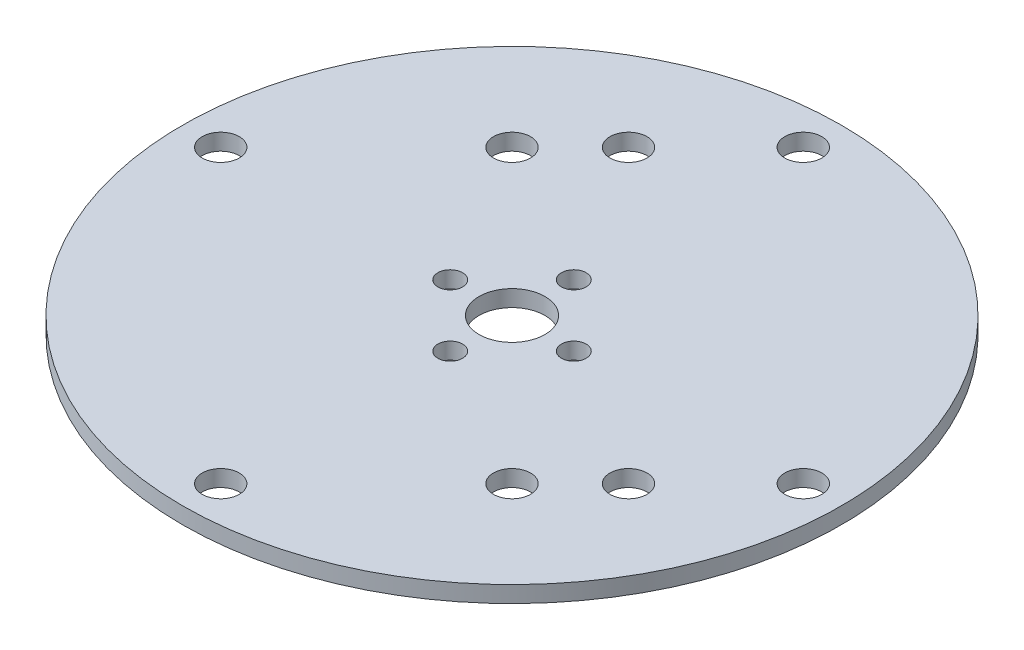
ISO-10303-21;
HEADER;
FILE_DESCRIPTION(('STEP AP214'),'2;1');
FILE_NAME('part.step','',(''),(''),'','','');
FILE_SCHEMA(('AUTOMOTIVE_DESIGN { 1 0 10303 214 1 1 1 1 }'));
ENDSEC;
DATA;
#1=APPLICATION_CONTEXT('core data for automotive mechanical design processes');
#2=APPLICATION_PROTOCOL_DEFINITION('international standard','automotive_design',2000,#1);
#3=PRODUCT_CONTEXT('',#1,'mechanical');
#4=PRODUCT('Part','Part','',(#3));
#5=PRODUCT_RELATED_PRODUCT_CATEGORY('part','',(#4));
#6=PRODUCT_DEFINITION_FORMATION('','',#4);
#7=PRODUCT_DEFINITION_CONTEXT('part definition',#1,'design');
#8=PRODUCT_DEFINITION('design','',#6,#7);
#9=PRODUCT_DEFINITION_SHAPE('','',#8);
#10=(LENGTH_UNIT() NAMED_UNIT(*) SI_UNIT(.MILLI.,.METRE.));
#11=(NAMED_UNIT(*) PLANE_ANGLE_UNIT() SI_UNIT($,.RADIAN.));
#12=(NAMED_UNIT(*) SI_UNIT($,.STERADIAN.) SOLID_ANGLE_UNIT());
#13=UNCERTAINTY_MEASURE_WITH_UNIT(LENGTH_MEASURE(1.E-05),#10,'distance_accuracy_value','');
#14=(GEOMETRIC_REPRESENTATION_CONTEXT(3) GLOBAL_UNCERTAINTY_ASSIGNED_CONTEXT((#13)) GLOBAL_UNIT_ASSIGNED_CONTEXT((#10,
#11,#12)) REPRESENTATION_CONTEXT('',''));
#15=CARTESIAN_POINT('',(0.,0.,0.));
#16=DIRECTION('',(0.,0.,1.));
#17=DIRECTION('',(1.,0.,0.));
#18=AXIS2_PLACEMENT_3D('',#15,#16,#17);
#19=CARTESIAN_POINT('',(0.,2.,0.));
#20=DIRECTION('',(0.,1.,0.));
#21=DIRECTION('',(0.,0.,1.));
#22=AXIS2_PLACEMENT_3D('',#19,#20,#21);
#23=PLANE('',#22);
#24=CARTESIAN_POINT('',(0.,2.,7.5));
#25=DIRECTION('',(0.,1.,0.));
#26=DIRECTION('',(0.,0.,1.));
#27=AXIS2_PLACEMENT_3D('',#24,#25,#26);
#28=CIRCLE('',#27,1.5);
#29=CARTESIAN_POINT('',(0.,2.,9.));
#30=VERTEX_POINT('',#29);
#31=EDGE_CURVE('E106',#30,#30,#28,.T.);
#32=ORIENTED_EDGE('',*,*,#31,.F.);
#33=EDGE_LOOP('',(#32));
#34=FACE_BOUND('',#33,.T.);
#35=CARTESIAN_POINT('',(0.,2.,-7.5));
#36=DIRECTION('',(0.,1.,0.));
#37=DIRECTION('',(0.,0.,1.));
#38=AXIS2_PLACEMENT_3D('',#35,#36,#37);
#39=CIRCLE('',#38,1.5);
#40=CARTESIAN_POINT('',(0.,2.,-6.));
#41=VERTEX_POINT('',#40);
#42=EDGE_CURVE('E94',#41,#41,#39,.T.);
#43=ORIENTED_EDGE('',*,*,#42,.F.);
#44=EDGE_LOOP('',(#43));
#45=FACE_BOUND('',#44,.T.);
#46=CARTESIAN_POINT('',(24.7487373415292,2.,10.6066017177983));
#47=DIRECTION('',(0.,1.,0.));
#48=DIRECTION('',(0.,0.,1.));
#49=AXIS2_PLACEMENT_3D('',#46,#47,#48);
#50=CIRCLE('',#49,2.24999999999999);
#51=CARTESIAN_POINT('',(24.7487373415292,2.,12.8566017177983));
#52=VERTEX_POINT('',#51);
#53=EDGE_CURVE('E82',#52,#52,#50,.T.);
#54=ORIENTED_EDGE('',*,*,#53,.F.);
#55=EDGE_LOOP('',(#54));
#56=FACE_BOUND('',#55,.T.);
#57=CARTESIAN_POINT('',(17.6776695296637,2.,17.6776695296637));
#58=DIRECTION('',(0.,1.,0.));
#59=DIRECTION('',(0.,0.,1.));
#60=AXIS2_PLACEMENT_3D('',#57,#58,#59);
#61=CIRCLE('',#60,2.25000000000007);
#62=CARTESIAN_POINT('',(17.6776695296637,2.,19.9276695296638));
#63=VERTEX_POINT('',#62);
#64=EDGE_CURVE('E70',#63,#63,#61,.T.);
#65=ORIENTED_EDGE('',*,*,#64,.F.);
#66=EDGE_LOOP('',(#65));
#67=FACE_BOUND('',#66,.T.);
#68=CARTESIAN_POINT('',(-35.3553390593274,2.,0.));
#69=DIRECTION('',(0.,1.,0.));
#70=DIRECTION('',(0.,0.,1.));
#71=AXIS2_PLACEMENT_3D('',#68,#69,#70);
#72=CIRCLE('',#71,2.25);
#73=CARTESIAN_POINT('',(-35.3553390593274,2.,2.25000000000006));
#74=VERTEX_POINT('',#73);
#75=EDGE_CURVE('E58',#74,#74,#72,.T.);
#76=ORIENTED_EDGE('',*,*,#75,.F.);
#77=EDGE_LOOP('',(#76));
#78=FACE_BOUND('',#77,.T.);
#79=CARTESIAN_POINT('',(35.3553390593274,2.,0.));
#80=DIRECTION('',(0.,1.,0.));
#81=DIRECTION('',(0.,0.,1.));
#82=AXIS2_PLACEMENT_3D('',#79,#80,#81);
#83=CIRCLE('',#82,2.25);
#84=CARTESIAN_POINT('',(35.3553390593274,2.,2.25000000000006));
#85=VERTEX_POINT('',#84);
#86=EDGE_CURVE('E46',#85,#85,#83,.T.);
#87=ORIENTED_EDGE('',*,*,#86,.F.);
#88=EDGE_LOOP('',(#87));
#89=FACE_BOUND('',#88,.T.);
#90=CARTESIAN_POINT('',(0.,2.,0.));
#91=DIRECTION('',(0.,1.,0.));
#92=DIRECTION('',(0.,0.,1.));
#93=AXIS2_PLACEMENT_3D('',#90,#91,#92);
#94=CIRCLE('',#93,40.);
#95=CARTESIAN_POINT('',(0.,2.,40.));
#96=VERTEX_POINT('',#95);
#97=EDGE_CURVE('E10',#96,#96,#94,.T.);
#98=ORIENTED_EDGE('',*,*,#97,.T.);
#99=EDGE_LOOP('',(#98));
#100=FACE_BOUND('',#99,.T.);
#101=CARTESIAN_POINT('',(0.,2.,-35.3553390593273));
#102=DIRECTION('',(0.,1.,0.));
#103=DIRECTION('',(0.,0.,1.));
#104=AXIS2_PLACEMENT_3D('',#101,#102,#103);
#105=CIRCLE('',#104,2.25);
#106=CARTESIAN_POINT('',(0.,2.,-33.1053390593273));
#107=VERTEX_POINT('',#106);
#108=EDGE_CURVE('E41',#107,#107,#105,.T.);
#109=ORIENTED_EDGE('',*,*,#108,.F.);
#110=EDGE_LOOP('',(#109));
#111=FACE_BOUND('',#110,.T.);
#112=CARTESIAN_POINT('',(0.,2.,35.3553390593274));
#113=DIRECTION('',(0.,1.,0.));
#114=DIRECTION('',(0.,0.,1.));
#115=AXIS2_PLACEMENT_3D('',#112,#113,#114);
#116=CIRCLE('',#115,2.25);
#117=CARTESIAN_POINT('',(0.,2.,37.6053390593274));
#118=VERTEX_POINT('',#117);
#119=EDGE_CURVE('E52',#118,#118,#116,.T.);
#120=ORIENTED_EDGE('',*,*,#119,.F.);
#121=EDGE_LOOP('',(#120));
#122=FACE_BOUND('',#121,.T.);
#123=CARTESIAN_POINT('',(-17.6776695296637,2.,-17.6776695296636));
#124=DIRECTION('',(0.,1.,0.));
#125=DIRECTION('',(0.,0.,1.));
#126=AXIS2_PLACEMENT_3D('',#123,#124,#125);
#127=CIRCLE('',#126,2.25);
#128=CARTESIAN_POINT('',(-17.6776695296637,2.,-15.4276695296636));
#129=VERTEX_POINT('',#128);
#130=EDGE_CURVE('E64',#129,#129,#127,.T.);
#131=ORIENTED_EDGE('',*,*,#130,.F.);
#132=EDGE_LOOP('',(#131));
#133=FACE_BOUND('',#132,.T.);
#134=CARTESIAN_POINT('',(-10.6066017177982,2.,-24.7487373415291));
#135=DIRECTION('',(0.,1.,0.));
#136=DIRECTION('',(0.,0.,1.));
#137=AXIS2_PLACEMENT_3D('',#134,#135,#136);
#138=CIRCLE('',#137,2.25000000000001);
#139=CARTESIAN_POINT('',(-10.6066017177982,2.,-22.4987373415291));
#140=VERTEX_POINT('',#139);
#141=EDGE_CURVE('E76',#140,#140,#138,.T.);
#142=ORIENTED_EDGE('',*,*,#141,.F.);
#143=EDGE_LOOP('',(#142));
#144=FACE_BOUND('',#143,.T.);
#145=CARTESIAN_POINT('',(0.,2.,0.));
#146=DIRECTION('',(0.,1.,0.));
#147=DIRECTION('',(0.,0.,1.));
#148=AXIS2_PLACEMENT_3D('',#145,#146,#147);
#149=CIRCLE('',#148,4.);
#150=CARTESIAN_POINT('',(0.,2.,4.));
#151=VERTEX_POINT('',#150);
#152=EDGE_CURVE('E88',#151,#151,#149,.T.);
#153=ORIENTED_EDGE('',*,*,#152,.F.);
#154=EDGE_LOOP('',(#153));
#155=FACE_BOUND('',#154,.T.);
#156=CARTESIAN_POINT('',(7.5,2.,0.));
#157=DIRECTION('',(0.,1.,0.));
#158=DIRECTION('',(0.,0.,1.));
#159=AXIS2_PLACEMENT_3D('',#156,#157,#158);
#160=CIRCLE('',#159,1.5);
#161=CARTESIAN_POINT('',(7.5,2.,1.50000000000003));
#162=VERTEX_POINT('',#161);
#163=EDGE_CURVE('E100',#162,#162,#160,.T.);
#164=ORIENTED_EDGE('',*,*,#163,.F.);
#165=EDGE_LOOP('',(#164));
#166=FACE_BOUND('',#165,.T.);
#167=CARTESIAN_POINT('',(-7.5,2.,0.));
#168=DIRECTION('',(0.,1.,0.));
#169=DIRECTION('',(0.,0.,1.));
#170=AXIS2_PLACEMENT_3D('',#167,#168,#169);
#171=CIRCLE('',#170,1.5);
#172=CARTESIAN_POINT('',(-7.5,2.,1.49999999999992));
#173=VERTEX_POINT('',#172);
#174=EDGE_CURVE('E112',#173,#173,#171,.T.);
#175=ORIENTED_EDGE('',*,*,#174,.F.);
#176=EDGE_LOOP('',(#175));
#177=FACE_BOUND('',#176,.T.);
#178=ADVANCED_FACE('F30',(#34,#45,#56,#67,#78,#89,#100,#111,#122,#133,#144,#155,#166,#177),#23,.T.);
#179=CARTESIAN_POINT('',(0.,0.,0.));
#180=DIRECTION('',(0.,1.,0.));
#181=DIRECTION('',(0.,0.,1.));
#182=AXIS2_PLACEMENT_3D('',#179,#180,#181);
#183=PLANE('',#182);
#184=CARTESIAN_POINT('',(0.,0.,7.5));
#185=DIRECTION('',(0.,1.,0.));
#186=DIRECTION('',(0.,0.,1.));
#187=AXIS2_PLACEMENT_3D('',#184,#185,#186);
#188=CIRCLE('',#187,1.5);
#189=CARTESIAN_POINT('',(0.,0.,9.));
#190=VERTEX_POINT('',#189);
#191=EDGE_CURVE('E109',#190,#190,#188,.T.);
#192=ORIENTED_EDGE('',*,*,#191,.T.);
#193=EDGE_LOOP('',(#192));
#194=FACE_BOUND('',#193,.T.);
#195=CARTESIAN_POINT('',(0.,0.,-7.5));
#196=DIRECTION('',(0.,1.,0.));
#197=DIRECTION('',(0.,0.,1.));
#198=AXIS2_PLACEMENT_3D('',#195,#196,#197);
#199=CIRCLE('',#198,1.5);
#200=CARTESIAN_POINT('',(0.,0.,-6.));
#201=VERTEX_POINT('',#200);
#202=EDGE_CURVE('E97',#201,#201,#199,.T.);
#203=ORIENTED_EDGE('',*,*,#202,.T.);
#204=EDGE_LOOP('',(#203));
#205=FACE_BOUND('',#204,.T.);
#206=CARTESIAN_POINT('',(24.7487373415292,0.,10.6066017177983));
#207=DIRECTION('',(0.,1.,0.));
#208=DIRECTION('',(0.,0.,1.));
#209=AXIS2_PLACEMENT_3D('',#206,#207,#208);
#210=CIRCLE('',#209,2.24999999999999);
#211=CARTESIAN_POINT('',(24.7487373415292,0.,12.8566017177983));
#212=VERTEX_POINT('',#211);
#213=EDGE_CURVE('E85',#212,#212,#210,.T.);
#214=ORIENTED_EDGE('',*,*,#213,.T.);
#215=EDGE_LOOP('',(#214));
#216=FACE_BOUND('',#215,.T.);
#217=CARTESIAN_POINT('',(17.6776695296637,0.,17.6776695296637));
#218=DIRECTION('',(0.,1.,0.));
#219=DIRECTION('',(0.,0.,1.));
#220=AXIS2_PLACEMENT_3D('',#217,#218,#219);
#221=CIRCLE('',#220,2.25000000000007);
#222=CARTESIAN_POINT('',(17.6776695296637,0.,19.9276695296638));
#223=VERTEX_POINT('',#222);
#224=EDGE_CURVE('E73',#223,#223,#221,.T.);
#225=ORIENTED_EDGE('',*,*,#224,.T.);
#226=EDGE_LOOP('',(#225));
#227=FACE_BOUND('',#226,.T.);
#228=CARTESIAN_POINT('',(-35.3553390593274,0.,0.));
#229=DIRECTION('',(0.,1.,0.));
#230=DIRECTION('',(0.,0.,1.));
#231=AXIS2_PLACEMENT_3D('',#228,#229,#230);
#232=CIRCLE('',#231,2.25);
#233=CARTESIAN_POINT('',(-35.3553390593274,0.,2.25000000000006));
#234=VERTEX_POINT('',#233);
#235=EDGE_CURVE('E61',#234,#234,#232,.T.);
#236=ORIENTED_EDGE('',*,*,#235,.T.);
#237=EDGE_LOOP('',(#236));
#238=FACE_BOUND('',#237,.T.);
#239=CARTESIAN_POINT('',(35.3553390593274,0.,0.));
#240=DIRECTION('',(0.,1.,0.));
#241=DIRECTION('',(0.,0.,1.));
#242=AXIS2_PLACEMENT_3D('',#239,#240,#241);
#243=CIRCLE('',#242,2.25);
#244=CARTESIAN_POINT('',(35.3553390593274,0.,2.25000000000006));
#245=VERTEX_POINT('',#244);
#246=EDGE_CURVE('E49',#245,#245,#243,.T.);
#247=ORIENTED_EDGE('',*,*,#246,.T.);
#248=EDGE_LOOP('',(#247));
#249=FACE_BOUND('',#248,.T.);
#250=CARTESIAN_POINT('',(0.,0.,0.));
#251=DIRECTION('',(0.,1.,0.));
#252=DIRECTION('',(0.,0.,1.));
#253=AXIS2_PLACEMENT_3D('',#250,#251,#252);
#254=CIRCLE('',#253,40.);
#255=CARTESIAN_POINT('',(0.,0.,40.));
#256=VERTEX_POINT('',#255);
#257=EDGE_CURVE('E34',#256,#256,#254,.T.);
#258=ORIENTED_EDGE('',*,*,#257,.F.);
#259=EDGE_LOOP('',(#258));
#260=FACE_BOUND('',#259,.T.);
#261=CARTESIAN_POINT('',(0.,0.,-35.3553390593273));
#262=DIRECTION('',(0.,1.,0.));
#263=DIRECTION('',(0.,0.,1.));
#264=AXIS2_PLACEMENT_3D('',#261,#262,#263);
#265=CIRCLE('',#264,2.25);
#266=CARTESIAN_POINT('',(0.,0.,-33.1053390593273));
#267=VERTEX_POINT('',#266);
#268=EDGE_CURVE('E43',#267,#267,#265,.T.);
#269=ORIENTED_EDGE('',*,*,#268,.T.);
#270=EDGE_LOOP('',(#269));
#271=FACE_BOUND('',#270,.T.);
#272=CARTESIAN_POINT('',(0.,0.,35.3553390593274));
#273=DIRECTION('',(0.,1.,0.));
#274=DIRECTION('',(0.,0.,1.));
#275=AXIS2_PLACEMENT_3D('',#272,#273,#274);
#276=CIRCLE('',#275,2.25);
#277=CARTESIAN_POINT('',(0.,0.,37.6053390593274));
#278=VERTEX_POINT('',#277);
#279=EDGE_CURVE('E55',#278,#278,#276,.T.);
#280=ORIENTED_EDGE('',*,*,#279,.T.);
#281=EDGE_LOOP('',(#280));
#282=FACE_BOUND('',#281,.T.);
#283=CARTESIAN_POINT('',(-17.6776695296637,0.,-17.6776695296636));
#284=DIRECTION('',(0.,1.,0.));
#285=DIRECTION('',(0.,0.,1.));
#286=AXIS2_PLACEMENT_3D('',#283,#284,#285);
#287=CIRCLE('',#286,2.25);
#288=CARTESIAN_POINT('',(-17.6776695296637,0.,-15.4276695296636));
#289=VERTEX_POINT('',#288);
#290=EDGE_CURVE('E67',#289,#289,#287,.T.);
#291=ORIENTED_EDGE('',*,*,#290,.T.);
#292=EDGE_LOOP('',(#291));
#293=FACE_BOUND('',#292,.T.);
#294=CARTESIAN_POINT('',(-10.6066017177982,0.,-24.7487373415291));
#295=DIRECTION('',(0.,1.,0.));
#296=DIRECTION('',(0.,0.,1.));
#297=AXIS2_PLACEMENT_3D('',#294,#295,#296);
#298=CIRCLE('',#297,2.25000000000001);
#299=CARTESIAN_POINT('',(-10.6066017177982,0.,-22.4987373415291));
#300=VERTEX_POINT('',#299);
#301=EDGE_CURVE('E79',#300,#300,#298,.T.);
#302=ORIENTED_EDGE('',*,*,#301,.T.);
#303=EDGE_LOOP('',(#302));
#304=FACE_BOUND('',#303,.T.);
#305=CARTESIAN_POINT('',(0.,0.,0.));
#306=DIRECTION('',(0.,1.,0.));
#307=DIRECTION('',(0.,0.,1.));
#308=AXIS2_PLACEMENT_3D('',#305,#306,#307);
#309=CIRCLE('',#308,4.);
#310=CARTESIAN_POINT('',(0.,0.,4.));
#311=VERTEX_POINT('',#310);
#312=EDGE_CURVE('E91',#311,#311,#309,.T.);
#313=ORIENTED_EDGE('',*,*,#312,.T.);
#314=EDGE_LOOP('',(#313));
#315=FACE_BOUND('',#314,.T.);
#316=CARTESIAN_POINT('',(7.5,0.,0.));
#317=DIRECTION('',(0.,1.,0.));
#318=DIRECTION('',(0.,0.,1.));
#319=AXIS2_PLACEMENT_3D('',#316,#317,#318);
#320=CIRCLE('',#319,1.5);
#321=CARTESIAN_POINT('',(7.5,0.,1.50000000000003));
#322=VERTEX_POINT('',#321);
#323=EDGE_CURVE('E103',#322,#322,#320,.T.);
#324=ORIENTED_EDGE('',*,*,#323,.T.);
#325=EDGE_LOOP('',(#324));
#326=FACE_BOUND('',#325,.T.);
#327=CARTESIAN_POINT('',(-7.5,0.,0.));
#328=DIRECTION('',(0.,1.,0.));
#329=DIRECTION('',(0.,0.,1.));
#330=AXIS2_PLACEMENT_3D('',#327,#328,#329);
#331=CIRCLE('',#330,1.5);
#332=CARTESIAN_POINT('',(-7.5,0.,1.49999999999992));
#333=VERTEX_POINT('',#332);
#334=EDGE_CURVE('E115',#333,#333,#331,.T.);
#335=ORIENTED_EDGE('',*,*,#334,.T.);
#336=EDGE_LOOP('',(#335));
#337=FACE_BOUND('',#336,.T.);
#338=ADVANCED_FACE('F125',(#194,#205,#216,#227,#238,#249,#260,#271,#282,#293,#304,#315,#326,
#337),#183,.F.);
#339=CARTESIAN_POINT('',(0.,2.,0.));
#340=DIRECTION('',(0.,-1.,0.));
#341=DIRECTION('',(0.,0.,-1.));
#342=AXIS2_PLACEMENT_3D('',#339,#340,#341);
#343=CYLINDRICAL_SURFACE('',#342,40.);
#344=ORIENTED_EDGE('',*,*,#97,.F.);
#345=EDGE_LOOP('',(#344));
#346=FACE_BOUND('',#345,.T.);
#347=ORIENTED_EDGE('',*,*,#257,.T.);
#348=EDGE_LOOP('',(#347));
#349=FACE_BOUND('',#348,.T.);
#350=ADVANCED_FACE('F32',(#346,#349),#343,.T.);
#351=CARTESIAN_POINT('',(0.,2.,-35.3553390593273));
#352=DIRECTION('',(0.,-1.,0.));
#353=DIRECTION('',(0.,0.,-1.));
#354=AXIS2_PLACEMENT_3D('',#351,#352,#353);
#355=CYLINDRICAL_SURFACE('',#354,2.25);
#356=ORIENTED_EDGE('',*,*,#108,.T.);
#357=EDGE_LOOP('',(#356));
#358=FACE_BOUND('',#357,.T.);
#359=ORIENTED_EDGE('',*,*,#268,.F.);
#360=EDGE_LOOP('',(#359));
#361=FACE_BOUND('',#360,.T.);
#362=ADVANCED_FACE('F135',(#358,#361),#355,.F.);
#363=CARTESIAN_POINT('',(35.3553390593274,2.,0.));
#364=DIRECTION('',(0.,-1.,0.));
#365=DIRECTION('',(0.,0.,-1.));
#366=AXIS2_PLACEMENT_3D('',#363,#364,#365);
#367=CYLINDRICAL_SURFACE('',#366,2.25);
#368=ORIENTED_EDGE('',*,*,#86,.T.);
#369=EDGE_LOOP('',(#368));
#370=FACE_BOUND('',#369,.T.);
#371=ORIENTED_EDGE('',*,*,#246,.F.);
#372=EDGE_LOOP('',(#371));
#373=FACE_BOUND('',#372,.T.);
#374=ADVANCED_FACE('F138',(#370,#373),#367,.F.);
#375=CARTESIAN_POINT('',(0.,2.,35.3553390593274));
#376=DIRECTION('',(0.,-1.,0.));
#377=DIRECTION('',(0.,0.,-1.));
#378=AXIS2_PLACEMENT_3D('',#375,#376,#377);
#379=CYLINDRICAL_SURFACE('',#378,2.25);
#380=ORIENTED_EDGE('',*,*,#119,.T.);
#381=EDGE_LOOP('',(#380));
#382=FACE_BOUND('',#381,.T.);
#383=ORIENTED_EDGE('',*,*,#279,.F.);
#384=EDGE_LOOP('',(#383));
#385=FACE_BOUND('',#384,.T.);
#386=ADVANCED_FACE('F142',(#382,#385),#379,.F.);
#387=CARTESIAN_POINT('',(-35.3553390593274,2.,0.));
#388=DIRECTION('',(0.,-1.,0.));
#389=DIRECTION('',(0.,0.,-1.));
#390=AXIS2_PLACEMENT_3D('',#387,#388,#389);
#391=CYLINDRICAL_SURFACE('',#390,2.25);
#392=ORIENTED_EDGE('',*,*,#75,.T.);
#393=EDGE_LOOP('',(#392));
#394=FACE_BOUND('',#393,.T.);
#395=ORIENTED_EDGE('',*,*,#235,.F.);
#396=EDGE_LOOP('',(#395));
#397=FACE_BOUND('',#396,.T.);
#398=ADVANCED_FACE('F146',(#394,#397),#391,.F.);
#399=CARTESIAN_POINT('',(-17.6776695296637,2.,-17.6776695296636));
#400=DIRECTION('',(0.,-1.,0.));
#401=DIRECTION('',(0.,0.,-1.));
#402=AXIS2_PLACEMENT_3D('',#399,#400,#401);
#403=CYLINDRICAL_SURFACE('',#402,2.25);
#404=ORIENTED_EDGE('',*,*,#130,.T.);
#405=EDGE_LOOP('',(#404));
#406=FACE_BOUND('',#405,.T.);
#407=ORIENTED_EDGE('',*,*,#290,.F.);
#408=EDGE_LOOP('',(#407));
#409=FACE_BOUND('',#408,.T.);
#410=ADVANCED_FACE('F150',(#406,#409),#403,.F.);
#411=CARTESIAN_POINT('',(17.6776695296637,2.,17.6776695296637));
#412=DIRECTION('',(0.,-1.,0.));
#413=DIRECTION('',(0.,0.,-1.));
#414=AXIS2_PLACEMENT_3D('',#411,#412,#413);
#415=CYLINDRICAL_SURFACE('',#414,2.25000000000007);
#416=ORIENTED_EDGE('',*,*,#64,.T.);
#417=EDGE_LOOP('',(#416));
#418=FACE_BOUND('',#417,.T.);
#419=ORIENTED_EDGE('',*,*,#224,.F.);
#420=EDGE_LOOP('',(#419));
#421=FACE_BOUND('',#420,.T.);
#422=ADVANCED_FACE('F154',(#418,#421),#415,.F.);
#423=CARTESIAN_POINT('',(-10.6066017177982,2.,-24.7487373415291));
#424=DIRECTION('',(0.,-1.,0.));
#425=DIRECTION('',(0.,0.,-1.));
#426=AXIS2_PLACEMENT_3D('',#423,#424,#425);
#427=CYLINDRICAL_SURFACE('',#426,2.25000000000001);
#428=ORIENTED_EDGE('',*,*,#141,.T.);
#429=EDGE_LOOP('',(#428));
#430=FACE_BOUND('',#429,.T.);
#431=ORIENTED_EDGE('',*,*,#301,.F.);
#432=EDGE_LOOP('',(#431));
#433=FACE_BOUND('',#432,.T.);
#434=ADVANCED_FACE('F158',(#430,#433),#427,.F.);
#435=CARTESIAN_POINT('',(24.7487373415292,2.,10.6066017177983));
#436=DIRECTION('',(0.,-1.,0.));
#437=DIRECTION('',(0.,0.,-1.));
#438=AXIS2_PLACEMENT_3D('',#435,#436,#437);
#439=CYLINDRICAL_SURFACE('',#438,2.24999999999999);
#440=ORIENTED_EDGE('',*,*,#53,.T.);
#441=EDGE_LOOP('',(#440));
#442=FACE_BOUND('',#441,.T.);
#443=ORIENTED_EDGE('',*,*,#213,.F.);
#444=EDGE_LOOP('',(#443));
#445=FACE_BOUND('',#444,.T.);
#446=ADVANCED_FACE('F162',(#442,#445),#439,.F.);
#447=CARTESIAN_POINT('',(0.,2.,0.));
#448=DIRECTION('',(0.,-1.,0.));
#449=DIRECTION('',(0.,0.,-1.));
#450=AXIS2_PLACEMENT_3D('',#447,#448,#449);
#451=CYLINDRICAL_SURFACE('',#450,4.);
#452=ORIENTED_EDGE('',*,*,#152,.T.);
#453=EDGE_LOOP('',(#452));
#454=FACE_BOUND('',#453,.T.);
#455=ORIENTED_EDGE('',*,*,#312,.F.);
#456=EDGE_LOOP('',(#455));
#457=FACE_BOUND('',#456,.T.);
#458=ADVANCED_FACE('F166',(#454,#457),#451,.F.);
#459=CARTESIAN_POINT('',(0.,2.,-7.5));
#460=DIRECTION('',(0.,-1.,0.));
#461=DIRECTION('',(0.,0.,-1.));
#462=AXIS2_PLACEMENT_3D('',#459,#460,#461);
#463=CYLINDRICAL_SURFACE('',#462,1.5);
#464=ORIENTED_EDGE('',*,*,#42,.T.);
#465=EDGE_LOOP('',(#464));
#466=FACE_BOUND('',#465,.T.);
#467=ORIENTED_EDGE('',*,*,#202,.F.);
#468=EDGE_LOOP('',(#467));
#469=FACE_BOUND('',#468,.T.);
#470=ADVANCED_FACE('F170',(#466,#469),#463,.F.);
#471=CARTESIAN_POINT('',(7.5,2.,0.));
#472=DIRECTION('',(0.,-1.,0.));
#473=DIRECTION('',(0.,0.,-1.));
#474=AXIS2_PLACEMENT_3D('',#471,#472,#473);
#475=CYLINDRICAL_SURFACE('',#474,1.5);
#476=ORIENTED_EDGE('',*,*,#163,.T.);
#477=EDGE_LOOP('',(#476));
#478=FACE_BOUND('',#477,.T.);
#479=ORIENTED_EDGE('',*,*,#323,.F.);
#480=EDGE_LOOP('',(#479));
#481=FACE_BOUND('',#480,.T.);
#482=ADVANCED_FACE('F174',(#478,#481),#475,.F.);
#483=CARTESIAN_POINT('',(0.,2.,7.5));
#484=DIRECTION('',(0.,-1.,0.));
#485=DIRECTION('',(0.,0.,-1.));
#486=AXIS2_PLACEMENT_3D('',#483,#484,#485);
#487=CYLINDRICAL_SURFACE('',#486,1.5);
#488=ORIENTED_EDGE('',*,*,#31,.T.);
#489=EDGE_LOOP('',(#488));
#490=FACE_BOUND('',#489,.T.);
#491=ORIENTED_EDGE('',*,*,#191,.F.);
#492=EDGE_LOOP('',(#491));
#493=FACE_BOUND('',#492,.T.);
#494=ADVANCED_FACE('F178',(#490,#493),#487,.F.);
#495=CARTESIAN_POINT('',(-7.5,2.,0.));
#496=DIRECTION('',(0.,-1.,0.));
#497=DIRECTION('',(0.,0.,-1.));
#498=AXIS2_PLACEMENT_3D('',#495,#496,#497);
#499=CYLINDRICAL_SURFACE('',#498,1.5);
#500=ORIENTED_EDGE('',*,*,#174,.T.);
#501=EDGE_LOOP('',(#500));
#502=FACE_BOUND('',#501,.T.);
#503=ORIENTED_EDGE('',*,*,#334,.F.);
#504=EDGE_LOOP('',(#503));
#505=FACE_BOUND('',#504,.T.);
#506=ADVANCED_FACE('F121',(#502,#505),#499,.F.);
#507=CLOSED_SHELL('',(#178,#338,#350,#362,#374,#386,#398,#410,#422,#434,#446,#458,#470,#482,
#494,#506));
#508=MANIFOLD_SOLID_BREP('B2',#507);
#509=ADVANCED_BREP_SHAPE_REPRESENTATION('',(#18,#508),#14);
#510=SHAPE_DEFINITION_REPRESENTATION(#9,#509);
ENDSEC;
END-ISO-10303-21;
